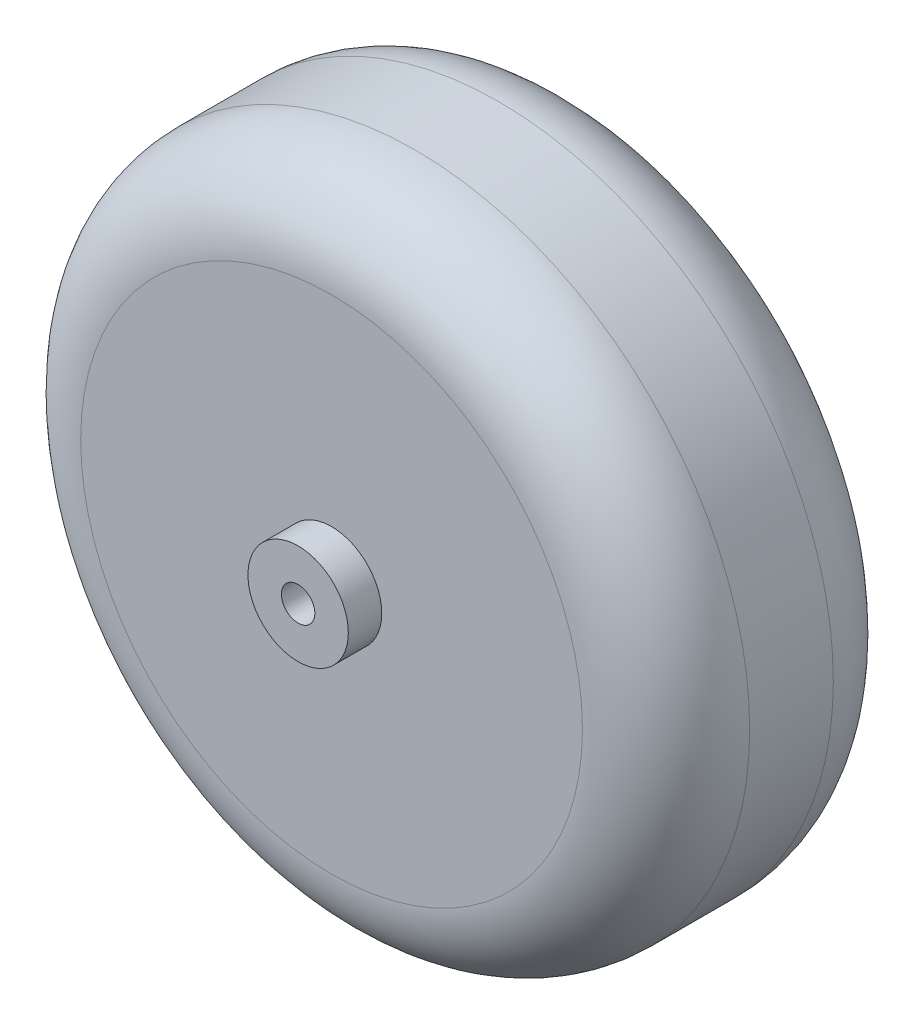
ISO-10303-21;
HEADER;
FILE_DESCRIPTION(('STEP AP214'),'2;1');
FILE_NAME('part.step','',(''),(''),'','','');
FILE_SCHEMA(('AUTOMOTIVE_DESIGN { 1 0 10303 214 1 1 1 1 }'));
ENDSEC;
DATA;
#1=APPLICATION_CONTEXT('core data for automotive mechanical design processes');
#2=APPLICATION_PROTOCOL_DEFINITION('international standard','automotive_design',2000,#1);
#3=PRODUCT_CONTEXT('',#1,'mechanical');
#4=PRODUCT('Part','Part','',(#3));
#5=PRODUCT_RELATED_PRODUCT_CATEGORY('part','',(#4));
#6=PRODUCT_DEFINITION_FORMATION('','',#4);
#7=PRODUCT_DEFINITION_CONTEXT('part definition',#1,'design');
#8=PRODUCT_DEFINITION('design','',#6,#7);
#9=PRODUCT_DEFINITION_SHAPE('','',#8);
#10=(LENGTH_UNIT() NAMED_UNIT(*) SI_UNIT(.MILLI.,.METRE.));
#11=(NAMED_UNIT(*) PLANE_ANGLE_UNIT() SI_UNIT($,.RADIAN.));
#12=(NAMED_UNIT(*) SI_UNIT($,.STERADIAN.) SOLID_ANGLE_UNIT());
#13=UNCERTAINTY_MEASURE_WITH_UNIT(LENGTH_MEASURE(1.E-05),#10,'distance_accuracy_value','');
#14=(GEOMETRIC_REPRESENTATION_CONTEXT(3) GLOBAL_UNCERTAINTY_ASSIGNED_CONTEXT((#13)) GLOBAL_UNIT_ASSIGNED_CONTEXT((#10,
#11,#12)) REPRESENTATION_CONTEXT('',''));
#15=CARTESIAN_POINT('',(0.,0.,0.));
#16=DIRECTION('',(0.,0.,1.));
#17=DIRECTION('',(1.,0.,0.));
#18=AXIS2_PLACEMENT_3D('',#15,#16,#17);
#19=CARTESIAN_POINT('',(0.,0.,7.5));
#20=DIRECTION('',(0.,0.,-1.));
#21=DIRECTION('',(-1.,0.,0.));
#22=AXIS2_PLACEMENT_3D('',#19,#20,#21);
#23=CYLINDRICAL_SURFACE('',#22,20.);
#24=CARTESIAN_POINT('',(0.,0.,-2.5));
#25=DIRECTION('',(0.,0.,1.));
#26=DIRECTION('',(1.,0.,0.));
#27=AXIS2_PLACEMENT_3D('',#24,#25,#26);
#28=CIRCLE('',#27,20.);
#29=CARTESIAN_POINT('',(20.,0.,-2.5));
#30=VERTEX_POINT('',#29);
#31=EDGE_CURVE('E52',#30,#30,#28,.T.);
#32=ORIENTED_EDGE('',*,*,#31,.T.);
#33=EDGE_LOOP('',(#32));
#34=FACE_BOUND('',#33,.T.);
#35=CARTESIAN_POINT('',(0.,0.,2.5));
#36=DIRECTION('',(0.,0.,1.));
#37=DIRECTION('',(1.,0.,0.));
#38=AXIS2_PLACEMENT_3D('',#35,#36,#37);
#39=CIRCLE('',#38,20.);
#40=CARTESIAN_POINT('',(20.,0.,2.5));
#41=VERTEX_POINT('',#40);
#42=EDGE_CURVE('E57',#41,#41,#39,.F.);
#43=ORIENTED_EDGE('',*,*,#42,.T.);
#44=EDGE_LOOP('',(#43));
#45=FACE_BOUND('',#44,.T.);
#46=ADVANCED_FACE('F39',(#34,#45),#23,.T.);
#47=CARTESIAN_POINT('',(0.,0.,7.5));
#48=DIRECTION('',(0.,0.,1.));
#49=DIRECTION('',(1.,0.,0.));
#50=AXIS2_PLACEMENT_3D('',#47,#48,#49);
#51=PLANE('',#50);
#52=CARTESIAN_POINT('',(0.,0.,7.5));
#53=DIRECTION('',(0.,0.,1.));
#54=DIRECTION('',(1.,0.,0.));
#55=AXIS2_PLACEMENT_3D('',#52,#53,#54);
#56=CIRCLE('',#55,3.);
#57=CARTESIAN_POINT('',(3.,0.,7.5));
#58=VERTEX_POINT('',#57);
#59=EDGE_CURVE('E64',#58,#58,#56,.T.);
#60=ORIENTED_EDGE('',*,*,#59,.F.);
#61=EDGE_LOOP('',(#60));
#62=FACE_BOUND('',#61,.T.);
#63=CARTESIAN_POINT('',(0.,0.,7.5));
#64=DIRECTION('',(0.,0.,1.));
#65=DIRECTION('',(1.,0.,0.));
#66=AXIS2_PLACEMENT_3D('',#63,#64,#65);
#67=CIRCLE('',#66,15.);
#68=CARTESIAN_POINT('',(15.,0.,7.5));
#69=VERTEX_POINT('',#68);
#70=EDGE_CURVE('E10',#69,#69,#67,.T.);
#71=ORIENTED_EDGE('',*,*,#70,.T.);
#72=EDGE_LOOP('',(#71));
#73=FACE_BOUND('',#72,.T.);
#74=ADVANCED_FACE('F110',(#62,#73),#51,.T.);
#75=CARTESIAN_POINT('',(0.,0.,-7.5));
#76=DIRECTION('',(0.,0.,1.));
#77=DIRECTION('',(1.,0.,0.));
#78=AXIS2_PLACEMENT_3D('',#75,#76,#77);
#79=PLANE('',#78);
#80=CARTESIAN_POINT('',(0.,0.,-7.5));
#81=DIRECTION('',(0.,0.,1.));
#82=DIRECTION('',(1.,0.,0.));
#83=AXIS2_PLACEMENT_3D('',#80,#81,#82);
#84=CIRCLE('',#83,3.);
#85=CARTESIAN_POINT('',(3.,0.,-7.5));
#86=VERTEX_POINT('',#85);
#87=EDGE_CURVE('E72',#86,#86,#84,.T.);
#88=ORIENTED_EDGE('',*,*,#87,.T.);
#89=EDGE_LOOP('',(#88));
#90=FACE_BOUND('',#89,.T.);
#91=CARTESIAN_POINT('',(0.,0.,-7.5));
#92=DIRECTION('',(0.,0.,1.));
#93=DIRECTION('',(1.,0.,0.));
#94=AXIS2_PLACEMENT_3D('',#91,#92,#93);
#95=CIRCLE('',#94,15.);
#96=CARTESIAN_POINT('',(15.,0.,-7.5));
#97=VERTEX_POINT('',#96);
#98=EDGE_CURVE('E47',#97,#97,#95,.F.);
#99=ORIENTED_EDGE('',*,*,#98,.T.);
#100=EDGE_LOOP('',(#99));
#101=FACE_BOUND('',#100,.T.);
#102=ADVANCED_FACE('F112',(#90,#101),#79,.F.);
#103=CARTESIAN_POINT('',(0.,0.,-2.5));
#104=DIRECTION('',(0.,0.,1.));
#105=DIRECTION('',(1.,0.,0.));
#106=AXIS2_PLACEMENT_3D('',#103,#104,#105);
#107=TOROIDAL_SURFACE('',#106,15.,5.);
#108=ORIENTED_EDGE('',*,*,#98,.F.);
#109=EDGE_LOOP('',(#108));
#110=FACE_BOUND('',#109,.T.);
#111=ORIENTED_EDGE('',*,*,#31,.F.);
#112=EDGE_LOOP('',(#111));
#113=FACE_BOUND('',#112,.T.);
#114=ADVANCED_FACE('F118',(#110,#113),#107,.T.);
#115=CARTESIAN_POINT('',(0.,0.,2.5));
#116=DIRECTION('',(0.,0.,1.));
#117=DIRECTION('',(1.,0.,0.));
#118=AXIS2_PLACEMENT_3D('',#115,#116,#117);
#119=TOROIDAL_SURFACE('',#118,15.,5.);
#120=ORIENTED_EDGE('',*,*,#42,.F.);
#121=EDGE_LOOP('',(#120));
#122=FACE_BOUND('',#121,.T.);
#123=ORIENTED_EDGE('',*,*,#70,.F.);
#124=EDGE_LOOP('',(#123));
#125=FACE_BOUND('',#124,.T.);
#126=ADVANCED_FACE('F41',(#122,#125),#119,.T.);
#127=CARTESIAN_POINT('',(0.,0.,9.5));
#128=DIRECTION('',(0.,0.,-1.));
#129=DIRECTION('',(-1.,0.,0.));
#130=AXIS2_PLACEMENT_3D('',#127,#128,#129);
#131=CYLINDRICAL_SURFACE('',#130,3.);
#132=CARTESIAN_POINT('',(0.,0.,9.5));
#133=DIRECTION('',(0.,0.,1.));
#134=DIRECTION('',(1.,0.,0.));
#135=AXIS2_PLACEMENT_3D('',#132,#133,#134);
#136=CIRCLE('',#135,3.);
#137=CARTESIAN_POINT('',(3.,0.,9.5));
#138=VERTEX_POINT('',#137);
#139=EDGE_CURVE('E63',#138,#138,#136,.T.);
#140=ORIENTED_EDGE('',*,*,#139,.F.);
#141=EDGE_LOOP('',(#140));
#142=FACE_BOUND('',#141,.T.);
#143=ORIENTED_EDGE('',*,*,#59,.T.);
#144=EDGE_LOOP('',(#143));
#145=FACE_BOUND('',#144,.T.);
#146=ADVANCED_FACE('F101',(#142,#145),#131,.T.);
#147=CARTESIAN_POINT('',(0.,0.,9.5));
#148=DIRECTION('',(0.,0.,1.));
#149=DIRECTION('',(1.,0.,0.));
#150=AXIS2_PLACEMENT_3D('',#147,#148,#149);
#151=PLANE('',#150);
#152=CARTESIAN_POINT('',(0.,0.,9.5));
#153=DIRECTION('',(0.,0.,1.));
#154=DIRECTION('',(1.,0.,0.));
#155=AXIS2_PLACEMENT_3D('',#152,#153,#154);
#156=CIRCLE('',#155,1.);
#157=CARTESIAN_POINT('',(1.,0.,9.5));
#158=VERTEX_POINT('',#157);
#159=EDGE_CURVE('E80',#158,#158,#156,.T.);
#160=ORIENTED_EDGE('',*,*,#159,.F.);
#161=EDGE_LOOP('',(#160));
#162=FACE_BOUND('',#161,.T.);
#163=ORIENTED_EDGE('',*,*,#139,.T.);
#164=EDGE_LOOP('',(#163));
#165=FACE_BOUND('',#164,.T.);
#166=ADVANCED_FACE('F97',(#162,#165),#151,.T.);
#167=CARTESIAN_POINT('',(0.,0.,-9.5));
#168=DIRECTION('',(0.,0.,1.));
#169=DIRECTION('',(1.,0.,0.));
#170=AXIS2_PLACEMENT_3D('',#167,#168,#169);
#171=CYLINDRICAL_SURFACE('',#170,3.);
#172=CARTESIAN_POINT('',(0.,0.,-9.5));
#173=DIRECTION('',(0.,0.,1.));
#174=DIRECTION('',(1.,0.,0.));
#175=AXIS2_PLACEMENT_3D('',#172,#173,#174);
#176=CIRCLE('',#175,3.);
#177=CARTESIAN_POINT('',(3.,0.,-9.5));
#178=VERTEX_POINT('',#177);
#179=EDGE_CURVE('E68',#178,#178,#176,.T.);
#180=ORIENTED_EDGE('',*,*,#179,.T.);
#181=EDGE_LOOP('',(#180));
#182=FACE_BOUND('',#181,.T.);
#183=ORIENTED_EDGE('',*,*,#87,.F.);
#184=EDGE_LOOP('',(#183));
#185=FACE_BOUND('',#184,.T.);
#186=ADVANCED_FACE('F100',(#182,#185),#171,.T.);
#187=CARTESIAN_POINT('',(0.,0.,-9.5));
#188=DIRECTION('',(0.,0.,-1.));
#189=DIRECTION('',(1.,0.,0.));
#190=AXIS2_PLACEMENT_3D('',#187,#188,#189);
#191=PLANE('',#190);
#192=CARTESIAN_POINT('',(0.,0.,-9.5));
#193=DIRECTION('',(0.,0.,1.));
#194=DIRECTION('',(1.,0.,0.));
#195=AXIS2_PLACEMENT_3D('',#192,#193,#194);
#196=CIRCLE('',#195,1.);
#197=CARTESIAN_POINT('',(1.,0.,-9.5));
#198=VERTEX_POINT('',#197);
#199=EDGE_CURVE('E76',#198,#198,#196,.T.);
#200=ORIENTED_EDGE('',*,*,#199,.T.);
#201=EDGE_LOOP('',(#200));
#202=FACE_BOUND('',#201,.T.);
#203=ORIENTED_EDGE('',*,*,#179,.F.);
#204=EDGE_LOOP('',(#203));
#205=FACE_BOUND('',#204,.T.);
#206=ADVANCED_FACE('F88',(#202,#205),#191,.T.);
#207=CARTESIAN_POINT('',(0.,0.,-9.5));
#208=DIRECTION('',(0.,0.,1.));
#209=DIRECTION('',(1.,0.,0.));
#210=AXIS2_PLACEMENT_3D('',#207,#208,#209);
#211=CYLINDRICAL_SURFACE('',#210,1.);
#212=ORIENTED_EDGE('',*,*,#199,.F.);
#213=EDGE_LOOP('',(#212));
#214=FACE_BOUND('',#213,.T.);
#215=ORIENTED_EDGE('',*,*,#159,.T.);
#216=EDGE_LOOP('',(#215));
#217=FACE_BOUND('',#216,.T.);
#218=ADVANCED_FACE('F91',(#214,#217),#211,.F.);
#219=CLOSED_SHELL('',(#46,#74,#102,#114,#126,#146,#166,#186,#206,#218));
#220=MANIFOLD_SOLID_BREP('B2',#219);
#221=ADVANCED_BREP_SHAPE_REPRESENTATION('',(#18,#220),#14);
#222=SHAPE_DEFINITION_REPRESENTATION(#9,#221);
ENDSEC;
END-ISO-10303-21;
